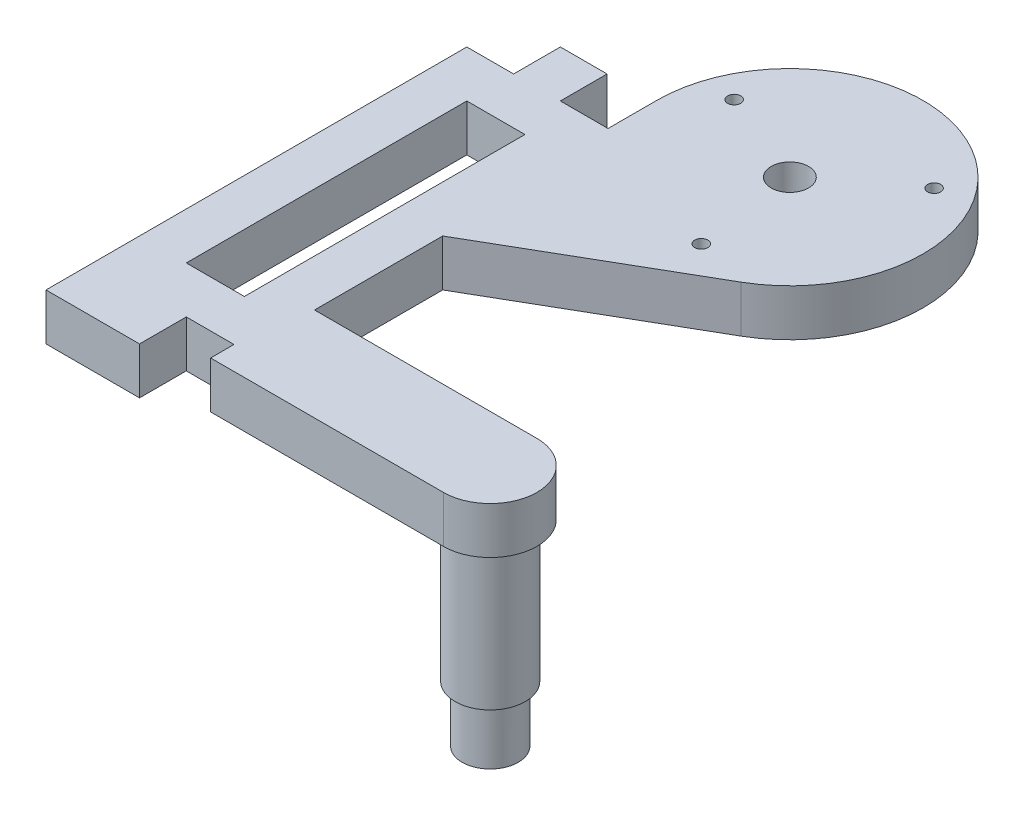
ISO-10303-21;
HEADER;
FILE_DESCRIPTION(('STEP AP214'),'2;1');
FILE_NAME('part.step','',(''),(''),'','','');
FILE_SCHEMA(('AUTOMOTIVE_DESIGN { 1 0 10303 214 1 1 1 1 }'));
ENDSEC;
DATA;
#1=APPLICATION_CONTEXT('core data for automotive mechanical design processes');
#2=APPLICATION_PROTOCOL_DEFINITION('international standard','automotive_design',2000,#1);
#3=PRODUCT_CONTEXT('',#1,'mechanical');
#4=PRODUCT('Part','Part','',(#3));
#5=PRODUCT_RELATED_PRODUCT_CATEGORY('part','',(#4));
#6=PRODUCT_DEFINITION_FORMATION('','',#4);
#7=PRODUCT_DEFINITION_CONTEXT('part definition',#1,'design');
#8=PRODUCT_DEFINITION('design','',#6,#7);
#9=PRODUCT_DEFINITION_SHAPE('','',#8);
#10=(LENGTH_UNIT() NAMED_UNIT(*) SI_UNIT(.MILLI.,.METRE.));
#11=(NAMED_UNIT(*) PLANE_ANGLE_UNIT() SI_UNIT($,.RADIAN.));
#12=(NAMED_UNIT(*) SI_UNIT($,.STERADIAN.) SOLID_ANGLE_UNIT());
#13=UNCERTAINTY_MEASURE_WITH_UNIT(LENGTH_MEASURE(1.E-05),#10,'distance_accuracy_value','');
#14=(GEOMETRIC_REPRESENTATION_CONTEXT(3) GLOBAL_UNCERTAINTY_ASSIGNED_CONTEXT((#13)) GLOBAL_UNIT_ASSIGNED_CONTEXT((#10,
#11,#12)) REPRESENTATION_CONTEXT('',''));
#15=CARTESIAN_POINT('',(0.,0.,0.));
#16=DIRECTION('',(0.,0.,1.));
#17=DIRECTION('',(1.,0.,0.));
#18=AXIS2_PLACEMENT_3D('',#15,#16,#17);
#19=CARTESIAN_POINT('',(0.,5.,-35.));
#20=DIRECTION('',(0.,0.,-1.));
#21=DIRECTION('',(-1.,0.,0.));
#22=AXIS2_PLACEMENT_3D('',#19,#20,#21);
#23=PLANE('',#22);
#24=DIRECTION('',(1.,0.,0.));
#25=VECTOR('',#24,1.);
#26=CARTESIAN_POINT('',(0.,0.,-35.));
#27=LINE('',#26,#25);
#28=CARTESIAN_POINT('',(5.,0.,-35.));
#29=VERTEX_POINT('',#28);
#30=CARTESIAN_POINT('',(11.2132580903823,0.,-35.));
#31=VERTEX_POINT('',#30);
#32=EDGE_CURVE('E297',#29,#31,#27,.T.);
#33=ORIENTED_EDGE('',*,*,#32,.T.);
#34=DIRECTION('',(0.,-1.,0.));
#35=VECTOR('',#34,1.);
#36=CARTESIAN_POINT('',(11.2132580903823,5.,-35.));
#37=LINE('',#36,#35);
#38=CARTESIAN_POINT('',(11.2132580903823,5.,-35.));
#39=VERTEX_POINT('',#38);
#40=EDGE_CURVE('E51',#39,#31,#37,.T.);
#41=ORIENTED_EDGE('',*,*,#40,.F.);
#42=DIRECTION('',(1.,0.,0.));
#43=VECTOR('',#42,1.);
#44=CARTESIAN_POINT('',(0.,5.,-35.));
#45=LINE('',#44,#43);
#46=CARTESIAN_POINT('',(5.,5.,-35.));
#47=VERTEX_POINT('',#46);
#48=EDGE_CURVE('E198',#47,#39,#45,.T.);
#49=ORIENTED_EDGE('',*,*,#48,.F.);
#50=DIRECTION('',(0.,-1.,0.));
#51=VECTOR('',#50,1.);
#52=CARTESIAN_POINT('',(5.,5.,-35.));
#53=LINE('',#52,#51);
#54=EDGE_CURVE('E59',#47,#29,#53,.T.);
#55=ORIENTED_EDGE('',*,*,#54,.T.);
#56=EDGE_LOOP('',(#33,#41,#49,#55));
#57=FACE_BOUND('',#56,.T.);
#58=ADVANCED_FACE('F41',(#57),#23,.F.);
#59=CARTESIAN_POINT('',(11.2132580903823,5.,0.));
#60=DIRECTION('',(1.,0.,0.));
#61=DIRECTION('',(0.,0.,-1.));
#62=AXIS2_PLACEMENT_3D('',#59,#60,#61);
#63=PLANE('',#62);
#64=DIRECTION('',(0.,0.,1.));
#65=VECTOR('',#64,1.);
#66=CARTESIAN_POINT('',(11.2132580903823,0.,0.));
#67=LINE('',#66,#65);
#68=CARTESIAN_POINT('',(11.2132580903823,0.,-5.));
#69=VERTEX_POINT('',#68);
#70=EDGE_CURVE('E207',#31,#69,#67,.T.);
#71=ORIENTED_EDGE('',*,*,#70,.T.);
#72=DIRECTION('',(0.,-1.,0.));
#73=VECTOR('',#72,1.);
#74=CARTESIAN_POINT('',(11.2132580903823,5.,-5.));
#75=LINE('',#74,#73);
#76=CARTESIAN_POINT('',(11.2132580903823,5.,-5.));
#77=VERTEX_POINT('',#76);
#78=EDGE_CURVE('E205',#77,#69,#75,.T.);
#79=ORIENTED_EDGE('',*,*,#78,.F.);
#80=DIRECTION('',(0.,0.,1.));
#81=VECTOR('',#80,1.);
#82=CARTESIAN_POINT('',(11.2132580903823,5.,0.));
#83=LINE('',#82,#81);
#84=EDGE_CURVE('E192',#39,#77,#83,.T.);
#85=ORIENTED_EDGE('',*,*,#84,.F.);
#86=ORIENTED_EDGE('',*,*,#40,.T.);
#87=EDGE_LOOP('',(#71,#79,#85,#86));
#88=FACE_BOUND('',#87,.T.);
#89=ADVANCED_FACE('F206',(#88),#63,.F.);
#90=CARTESIAN_POINT('',(0.,5.,-5.));
#91=DIRECTION('',(0.,0.,-1.));
#92=DIRECTION('',(-1.,0.,0.));
#93=AXIS2_PLACEMENT_3D('',#90,#91,#92);
#94=PLANE('',#93);
#95=DIRECTION('',(1.,0.,0.));
#96=VECTOR('',#95,1.);
#97=CARTESIAN_POINT('',(0.,0.,-5.));
#98=LINE('',#97,#96);
#99=CARTESIAN_POINT('',(5.,0.,-5.));
#100=VERTEX_POINT('',#99);
#101=EDGE_CURVE('E302',#100,#69,#98,.T.);
#102=ORIENTED_EDGE('',*,*,#101,.F.);
#103=DIRECTION('',(0.,-1.,0.));
#104=VECTOR('',#103,1.);
#105=CARTESIAN_POINT('',(5.,5.,-5.));
#106=LINE('',#105,#104);
#107=CARTESIAN_POINT('',(5.,5.,-5.));
#108=VERTEX_POINT('',#107);
#109=EDGE_CURVE('E124',#108,#100,#106,.T.);
#110=ORIENTED_EDGE('',*,*,#109,.F.);
#111=DIRECTION('',(1.,0.,0.));
#112=VECTOR('',#111,1.);
#113=CARTESIAN_POINT('',(0.,5.,-5.));
#114=LINE('',#113,#112);
#115=EDGE_CURVE('E197',#108,#77,#114,.T.);
#116=ORIENTED_EDGE('',*,*,#115,.T.);
#117=ORIENTED_EDGE('',*,*,#78,.T.);
#118=EDGE_LOOP('',(#102,#110,#116,#117));
#119=FACE_BOUND('',#118,.T.);
#120=ADVANCED_FACE('F212',(#119),#94,.T.);
#121=CARTESIAN_POINT('',(29.3300644655773,5.,-45.2120339474557));
#122=DIRECTION('',(0.,-1.,0.));
#123=DIRECTION('',(0.,0.,-1.));
#124=AXIS2_PLACEMENT_3D('',#121,#122,#123);
#125=CYLINDRICAL_SURFACE('',#124,14.2300644655773);
#126=CARTESIAN_POINT('',(29.3300644655773,0.,-45.2120339474557));
#127=DIRECTION('',(0.,1.,0.));
#128=DIRECTION('',(0.,0.,1.));
#129=AXIS2_PLACEMENT_3D('',#126,#127,#128);
#130=CIRCLE('',#129,14.2300644655773);
#131=CARTESIAN_POINT('',(36.4450966983659,0.,-32.8884366227755));
#132=VERTEX_POINT('',#131);
#133=CARTESIAN_POINT('',(15.1,0.,-45.2120339474557));
#134=VERTEX_POINT('',#133);
#135=EDGE_CURVE('E238',#132,#134,#130,.T.);
#136=ORIENTED_EDGE('',*,*,#135,.T.);
#137=DIRECTION('',(0.,-1.,0.));
#138=VECTOR('',#137,1.);
#139=CARTESIAN_POINT('',(15.1,5.,-45.2120339474557));
#140=LINE('',#139,#138);
#141=CARTESIAN_POINT('',(15.1,5.,-45.2120339474557));
#142=VERTEX_POINT('',#141);
#143=EDGE_CURVE('E312',#142,#134,#140,.T.);
#144=ORIENTED_EDGE('',*,*,#143,.F.);
#145=CARTESIAN_POINT('',(29.3300644655773,5.,-45.2120339474557));
#146=DIRECTION('',(0.,1.,0.));
#147=DIRECTION('',(0.,0.,1.));
#148=AXIS2_PLACEMENT_3D('',#145,#146,#147);
#149=CIRCLE('',#148,14.2300644655773);
#150=CARTESIAN_POINT('',(36.4450966983659,5.,-32.8884366227755));
#151=VERTEX_POINT('',#150);
#152=EDGE_CURVE('E403',#151,#142,#149,.T.);
#153=ORIENTED_EDGE('',*,*,#152,.F.);
#154=DIRECTION('',(0.,-1.,0.));
#155=VECTOR('',#154,1.);
#156=CARTESIAN_POINT('',(36.4450966983659,5.,-32.8884366227755));
#157=LINE('',#156,#155);
#158=EDGE_CURVE('E217',#151,#132,#157,.T.);
#159=ORIENTED_EDGE('',*,*,#158,.T.);
#160=EDGE_LOOP('',(#136,#144,#153,#159));
#161=FACE_BOUND('',#160,.T.);
#162=ADVANCED_FACE('F492',(#161),#125,.T.);
#163=CARTESIAN_POINT('',(15.1,5.,0.));
#164=DIRECTION('',(1.,0.,0.));
#165=DIRECTION('',(0.,0.,-1.));
#166=AXIS2_PLACEMENT_3D('',#163,#164,#165);
#167=PLANE('',#166);
#168=DIRECTION('',(0.,0.,1.));
#169=VECTOR('',#168,1.);
#170=CARTESIAN_POINT('',(15.1,0.,0.));
#171=LINE('',#170,#169);
#172=CARTESIAN_POINT('',(15.1,0.,-40.));
#173=VERTEX_POINT('',#172);
#174=EDGE_CURVE('E242',#134,#173,#171,.T.);
#175=ORIENTED_EDGE('',*,*,#174,.T.);
#176=DIRECTION('',(0.,-1.,0.));
#177=VECTOR('',#176,1.);
#178=CARTESIAN_POINT('',(15.1,5.,-40.));
#179=LINE('',#178,#177);
#180=CARTESIAN_POINT('',(15.1,5.,-40.));
#181=VERTEX_POINT('',#180);
#182=EDGE_CURVE('E367',#181,#173,#179,.T.);
#183=ORIENTED_EDGE('',*,*,#182,.F.);
#184=DIRECTION('',(0.,0.,1.));
#185=VECTOR('',#184,1.);
#186=CARTESIAN_POINT('',(15.1,5.,0.));
#187=LINE('',#186,#185);
#188=EDGE_CURVE('E137',#142,#181,#187,.T.);
#189=ORIENTED_EDGE('',*,*,#188,.F.);
#190=ORIENTED_EDGE('',*,*,#143,.T.);
#191=EDGE_LOOP('',(#175,#183,#189,#190));
#192=FACE_BOUND('',#191,.T.);
#193=ADVANCED_FACE('F487',(#192),#167,.F.);
#194=CARTESIAN_POINT('',(0.,5.,-40.));
#195=DIRECTION('',(0.,0.,-1.));
#196=DIRECTION('',(-1.,0.,0.));
#197=AXIS2_PLACEMENT_3D('',#194,#195,#196);
#198=PLANE('',#197);
#199=DIRECTION('',(1.,0.,0.));
#200=VECTOR('',#199,1.);
#201=CARTESIAN_POINT('',(0.,0.,-40.));
#202=LINE('',#201,#200);
#203=CARTESIAN_POINT('',(10.,0.,-40.));
#204=VERTEX_POINT('',#203);
#205=EDGE_CURVE('E246',#204,#173,#202,.T.);
#206=ORIENTED_EDGE('',*,*,#205,.F.);
#207=DIRECTION('',(0.,-1.,0.));
#208=VECTOR('',#207,1.);
#209=CARTESIAN_POINT('',(10.,5.,-40.));
#210=LINE('',#209,#208);
#211=CARTESIAN_POINT('',(10.,5.,-40.));
#212=VERTEX_POINT('',#211);
#213=EDGE_CURVE('E364',#212,#204,#210,.T.);
#214=ORIENTED_EDGE('',*,*,#213,.F.);
#215=DIRECTION('',(1.,0.,0.));
#216=VECTOR('',#215,1.);
#217=CARTESIAN_POINT('',(0.,5.,-40.));
#218=LINE('',#217,#216);
#219=EDGE_CURVE('E408',#212,#181,#218,.T.);
#220=ORIENTED_EDGE('',*,*,#219,.T.);
#221=ORIENTED_EDGE('',*,*,#182,.T.);
#222=EDGE_LOOP('',(#206,#214,#220,#221));
#223=FACE_BOUND('',#222,.T.);
#224=ADVANCED_FACE('F484',(#223),#198,.T.);
#225=CARTESIAN_POINT('',(10.,5.,0.));
#226=DIRECTION('',(-1.,0.,0.));
#227=DIRECTION('',(0.,0.,1.));
#228=AXIS2_PLACEMENT_3D('',#225,#226,#227);
#229=PLANE('',#228);
#230=DIRECTION('',(0.,0.,-1.));
#231=VECTOR('',#230,1.);
#232=CARTESIAN_POINT('',(10.,0.,0.));
#233=LINE('',#232,#231);
#234=CARTESIAN_POINT('',(10.,0.,-45.));
#235=VERTEX_POINT('',#234);
#236=EDGE_CURVE('E250',#204,#235,#233,.T.);
#237=ORIENTED_EDGE('',*,*,#236,.T.);
#238=DIRECTION('',(0.,-1.,0.));
#239=VECTOR('',#238,1.);
#240=CARTESIAN_POINT('',(10.,5.,-45.));
#241=LINE('',#240,#239);
#242=CARTESIAN_POINT('',(10.,5.,-45.));
#243=VERTEX_POINT('',#242);
#244=EDGE_CURVE('E360',#243,#235,#241,.T.);
#245=ORIENTED_EDGE('',*,*,#244,.F.);
#246=DIRECTION('',(0.,0.,-1.));
#247=VECTOR('',#246,1.);
#248=CARTESIAN_POINT('',(10.,5.,0.));
#249=LINE('',#248,#247);
#250=EDGE_CURVE('E412',#212,#243,#249,.T.);
#251=ORIENTED_EDGE('',*,*,#250,.F.);
#252=ORIENTED_EDGE('',*,*,#213,.T.);
#253=EDGE_LOOP('',(#237,#245,#251,#252));
#254=FACE_BOUND('',#253,.T.);
#255=ADVANCED_FACE('F538',(#254),#229,.F.);
#256=CARTESIAN_POINT('',(0.,5.,-45.));
#257=DIRECTION('',(0.,0.,1.));
#258=DIRECTION('',(1.,0.,0.));
#259=AXIS2_PLACEMENT_3D('',#256,#257,#258);
#260=PLANE('',#259);
#261=DIRECTION('',(-1.,0.,0.));
#262=VECTOR('',#261,1.);
#263=CARTESIAN_POINT('',(0.,0.,-45.));
#264=LINE('',#263,#262);
#265=CARTESIAN_POINT('',(5.,0.,-45.));
#266=VERTEX_POINT('',#265);
#267=EDGE_CURVE('E254',#235,#266,#264,.T.);
#268=ORIENTED_EDGE('',*,*,#267,.T.);
#269=DIRECTION('',(0.,-1.,0.));
#270=VECTOR('',#269,1.);
#271=CARTESIAN_POINT('',(5.,5.,-45.));
#272=LINE('',#271,#270);
#273=CARTESIAN_POINT('',(5.,5.,-45.));
#274=VERTEX_POINT('',#273);
#275=EDGE_CURVE('E357',#274,#266,#272,.T.);
#276=ORIENTED_EDGE('',*,*,#275,.F.);
#277=DIRECTION('',(-1.,0.,0.));
#278=VECTOR('',#277,1.);
#279=CARTESIAN_POINT('',(0.,5.,-45.));
#280=LINE('',#279,#278);
#281=EDGE_CURVE('E416',#243,#274,#280,.T.);
#282=ORIENTED_EDGE('',*,*,#281,.F.);
#283=ORIENTED_EDGE('',*,*,#244,.T.);
#284=EDGE_LOOP('',(#268,#276,#282,#283));
#285=FACE_BOUND('',#284,.T.);
#286=ADVANCED_FACE('F478',(#285),#260,.F.);
#287=CARTESIAN_POINT('',(5.,5.,0.));
#288=DIRECTION('',(-1.,0.,0.));
#289=DIRECTION('',(0.,0.,1.));
#290=AXIS2_PLACEMENT_3D('',#287,#288,#289);
#291=PLANE('',#290);
#292=DIRECTION('',(0.,0.,-1.));
#293=VECTOR('',#292,1.);
#294=CARTESIAN_POINT('',(5.,0.,0.));
#295=LINE('',#294,#293);
#296=CARTESIAN_POINT('',(5.,0.,-40.));
#297=VERTEX_POINT('',#296);
#298=EDGE_CURVE('E258',#297,#266,#295,.T.);
#299=ORIENTED_EDGE('',*,*,#298,.F.);
#300=DIRECTION('',(0.,-1.,0.));
#301=VECTOR('',#300,1.);
#302=CARTESIAN_POINT('',(5.,5.,-40.));
#303=LINE('',#302,#301);
#304=CARTESIAN_POINT('',(5.,5.,-40.));
#305=VERTEX_POINT('',#304);
#306=EDGE_CURVE('E354',#305,#297,#303,.T.);
#307=ORIENTED_EDGE('',*,*,#306,.F.);
#308=DIRECTION('',(0.,0.,-1.));
#309=VECTOR('',#308,1.);
#310=CARTESIAN_POINT('',(5.,5.,0.));
#311=LINE('',#310,#309);
#312=EDGE_CURVE('E419',#305,#274,#311,.T.);
#313=ORIENTED_EDGE('',*,*,#312,.T.);
#314=ORIENTED_EDGE('',*,*,#275,.T.);
#315=EDGE_LOOP('',(#299,#307,#313,#314));
#316=FACE_BOUND('',#315,.T.);
#317=ADVANCED_FACE('F474',(#316),#291,.T.);
#318=CARTESIAN_POINT('',(0.,0.,-40.));
#319=VERTEX_POINT('',#318);
#320=EDGE_CURVE('E251',#319,#297,#202,.T.);
#321=ORIENTED_EDGE('',*,*,#320,.F.);
#322=DIRECTION('',(0.,-1.,0.));
#323=VECTOR('',#322,1.);
#324=CARTESIAN_POINT('',(0.,5.,-40.));
#325=LINE('',#324,#323);
#326=CARTESIAN_POINT('',(0.,5.,-40.));
#327=VERTEX_POINT('',#326);
#328=EDGE_CURVE('E351',#327,#319,#325,.T.);
#329=ORIENTED_EDGE('',*,*,#328,.F.);
#330=EDGE_CURVE('E413',#327,#305,#218,.T.);
#331=ORIENTED_EDGE('',*,*,#330,.T.);
#332=ORIENTED_EDGE('',*,*,#306,.T.);
#333=EDGE_LOOP('',(#321,#329,#331,#332));
#334=FACE_BOUND('',#333,.T.);
#335=ADVANCED_FACE('F470',(#334),#198,.T.);
#336=CARTESIAN_POINT('',(0.,5.,0.));
#337=DIRECTION('',(-1.,0.,0.));
#338=DIRECTION('',(0.,0.,1.));
#339=AXIS2_PLACEMENT_3D('',#336,#337,#338);
#340=PLANE('',#339);
#341=DIRECTION('',(0.,0.,-1.));
#342=VECTOR('',#341,1.);
#343=CARTESIAN_POINT('',(0.,0.,0.));
#344=LINE('',#343,#342);
#345=CARTESIAN_POINT('',(0.,0.,5.));
#346=VERTEX_POINT('',#345);
#347=EDGE_CURVE('E262',#346,#319,#344,.T.);
#348=ORIENTED_EDGE('',*,*,#347,.F.);
#349=DIRECTION('',(0.,-1.,0.));
#350=VECTOR('',#349,1.);
#351=CARTESIAN_POINT('',(0.,5.,5.));
#352=LINE('',#351,#350);
#353=CARTESIAN_POINT('',(0.,5.,5.));
#354=VERTEX_POINT('',#353);
#355=EDGE_CURVE('E348',#354,#346,#352,.T.);
#356=ORIENTED_EDGE('',*,*,#355,.F.);
#357=DIRECTION('',(0.,0.,-1.));
#358=VECTOR('',#357,1.);
#359=CARTESIAN_POINT('',(0.,5.,0.));
#360=LINE('',#359,#358);
#361=EDGE_CURVE('E423',#354,#327,#360,.T.);
#362=ORIENTED_EDGE('',*,*,#361,.T.);
#363=ORIENTED_EDGE('',*,*,#328,.T.);
#364=EDGE_LOOP('',(#348,#356,#362,#363));
#365=FACE_BOUND('',#364,.T.);
#366=ADVANCED_FACE('F535',(#365),#340,.T.);
#367=CARTESIAN_POINT('',(0.,5.,5.));
#368=DIRECTION('',(0.,0.,-1.));
#369=DIRECTION('',(-1.,0.,0.));
#370=AXIS2_PLACEMENT_3D('',#367,#368,#369);
#371=PLANE('',#370);
#372=DIRECTION('',(1.,0.,0.));
#373=VECTOR('',#372,1.);
#374=CARTESIAN_POINT('',(0.,0.,5.));
#375=LINE('',#374,#373);
#376=CARTESIAN_POINT('',(10.,0.,5.));
#377=VERTEX_POINT('',#376);
#378=EDGE_CURVE('E266',#346,#377,#375,.T.);
#379=ORIENTED_EDGE('',*,*,#378,.T.);
#380=DIRECTION('',(0.,-1.,0.));
#381=VECTOR('',#380,1.);
#382=CARTESIAN_POINT('',(10.,5.,5.));
#383=LINE('',#382,#381);
#384=CARTESIAN_POINT('',(10.,5.,5.));
#385=VERTEX_POINT('',#384);
#386=EDGE_CURVE('E345',#385,#377,#383,.T.);
#387=ORIENTED_EDGE('',*,*,#386,.F.);
#388=DIRECTION('',(1.,0.,0.));
#389=VECTOR('',#388,1.);
#390=CARTESIAN_POINT('',(0.,5.,5.));
#391=LINE('',#390,#389);
#392=EDGE_CURVE('E427',#354,#385,#391,.T.);
#393=ORIENTED_EDGE('',*,*,#392,.F.);
#394=ORIENTED_EDGE('',*,*,#355,.T.);
#395=EDGE_LOOP('',(#379,#387,#393,#394));
#396=FACE_BOUND('',#395,.T.);
#397=ADVANCED_FACE('F533',(#396),#371,.F.);
#398=CARTESIAN_POINT('',(10.,5.,0.));
#399=DIRECTION('',(1.,0.,0.));
#400=DIRECTION('',(0.,0.,-1.));
#401=AXIS2_PLACEMENT_3D('',#398,#399,#400);
#402=PLANE('',#401);
#403=DIRECTION('',(0.,0.,1.));
#404=VECTOR('',#403,1.);
#405=CARTESIAN_POINT('',(10.,0.,0.));
#406=LINE('',#405,#404);
#407=CARTESIAN_POINT('',(10.,0.,0.));
#408=VERTEX_POINT('',#407);
#409=EDGE_CURVE('E270',#408,#377,#406,.T.);
#410=ORIENTED_EDGE('',*,*,#409,.F.);
#411=DIRECTION('',(0.,-1.,0.));
#412=VECTOR('',#411,1.);
#413=CARTESIAN_POINT('',(10.,5.,0.));
#414=LINE('',#413,#412);
#415=CARTESIAN_POINT('',(10.,5.,0.));
#416=VERTEX_POINT('',#415);
#417=EDGE_CURVE('E342',#416,#408,#414,.T.);
#418=ORIENTED_EDGE('',*,*,#417,.F.);
#419=DIRECTION('',(0.,0.,1.));
#420=VECTOR('',#419,1.);
#421=CARTESIAN_POINT('',(10.,5.,0.));
#422=LINE('',#421,#420);
#423=EDGE_CURVE('E430',#416,#385,#422,.T.);
#424=ORIENTED_EDGE('',*,*,#423,.T.);
#425=ORIENTED_EDGE('',*,*,#386,.T.);
#426=EDGE_LOOP('',(#410,#418,#424,#425));
#427=FACE_BOUND('',#426,.T.);
#428=ADVANCED_FACE('F529',(#427),#402,.T.);
#429=CARTESIAN_POINT('',(0.,5.,0.));
#430=DIRECTION('',(0.,0.,-1.));
#431=DIRECTION('',(-1.,0.,0.));
#432=AXIS2_PLACEMENT_3D('',#429,#430,#431);
#433=PLANE('',#432);
#434=DIRECTION('',(1.,0.,0.));
#435=VECTOR('',#434,1.);
#436=CARTESIAN_POINT('',(0.,0.,0.));
#437=LINE('',#436,#435);
#438=CARTESIAN_POINT('',(15.1,0.,0.));
#439=VERTEX_POINT('',#438);
#440=EDGE_CURVE('E274',#408,#439,#437,.T.);
#441=ORIENTED_EDGE('',*,*,#440,.T.);
#442=DIRECTION('',(0.,-1.,0.));
#443=VECTOR('',#442,1.);
#444=CARTESIAN_POINT('',(15.1,5.,0.));
#445=LINE('',#444,#443);
#446=CARTESIAN_POINT('',(15.1,5.,0.));
#447=VERTEX_POINT('',#446);
#448=EDGE_CURVE('E338',#447,#439,#445,.T.);
#449=ORIENTED_EDGE('',*,*,#448,.F.);
#450=DIRECTION('',(1.,0.,0.));
#451=VECTOR('',#450,1.);
#452=CARTESIAN_POINT('',(0.,5.,0.));
#453=LINE('',#452,#451);
#454=EDGE_CURVE('E434',#416,#447,#453,.T.);
#455=ORIENTED_EDGE('',*,*,#454,.F.);
#456=ORIENTED_EDGE('',*,*,#417,.T.);
#457=EDGE_LOOP('',(#441,#449,#455,#456));
#458=FACE_BOUND('',#457,.T.);
#459=ADVANCED_FACE('F525',(#458),#433,.F.);
#460=CARTESIAN_POINT('',(15.1,5.,0.));
#461=DIRECTION('',(1.,0.,0.));
#462=DIRECTION('',(0.,0.,-1.));
#463=AXIS2_PLACEMENT_3D('',#460,#461,#462);
#464=PLANE('',#463);
#465=DIRECTION('',(0.,0.,1.));
#466=VECTOR('',#465,1.);
#467=CARTESIAN_POINT('',(15.1,0.,0.));
#468=LINE('',#467,#466);
#469=CARTESIAN_POINT('',(15.1,0.,2.5));
#470=VERTEX_POINT('',#469);
#471=EDGE_CURVE('E277',#439,#470,#468,.T.);
#472=ORIENTED_EDGE('',*,*,#471,.T.);
#473=DIRECTION('',(0.,-1.,0.));
#474=VECTOR('',#473,1.);
#475=CARTESIAN_POINT('',(15.1,5.,2.5));
#476=LINE('',#475,#474);
#477=CARTESIAN_POINT('',(15.1,5.,2.5));
#478=VERTEX_POINT('',#477);
#479=EDGE_CURVE('E334',#478,#470,#476,.T.);
#480=ORIENTED_EDGE('',*,*,#479,.F.);
#481=DIRECTION('',(0.,0.,1.));
#482=VECTOR('',#481,1.);
#483=CARTESIAN_POINT('',(15.1,5.,0.));
#484=LINE('',#483,#482);
#485=EDGE_CURVE('E437',#447,#478,#484,.T.);
#486=ORIENTED_EDGE('',*,*,#485,.F.);
#487=ORIENTED_EDGE('',*,*,#448,.T.);
#488=EDGE_LOOP('',(#472,#480,#486,#487));
#489=FACE_BOUND('',#488,.T.);
#490=ADVANCED_FACE('F521',(#489),#464,.F.);
#491=CARTESIAN_POINT('',(0.,5.,2.5));
#492=DIRECTION('',(0.,0.,-1.));
#493=DIRECTION('',(-1.,0.,0.));
#494=AXIS2_PLACEMENT_3D('',#491,#492,#493);
#495=PLANE('',#494);
#496=DIRECTION('',(1.,0.,0.));
#497=VECTOR('',#496,1.);
#498=CARTESIAN_POINT('',(0.,0.,2.5));
#499=LINE('',#498,#497);
#500=CARTESIAN_POINT('',(40.,0.,2.5));
#501=VERTEX_POINT('',#500);
#502=EDGE_CURVE('E280',#470,#501,#499,.T.);
#503=ORIENTED_EDGE('',*,*,#502,.T.);
#504=DIRECTION('',(0.,-1.,0.));
#505=VECTOR('',#504,1.);
#506=CARTESIAN_POINT('',(40.,5.,2.5));
#507=LINE('',#506,#505);
#508=CARTESIAN_POINT('',(40.,5.,2.5));
#509=VERTEX_POINT('',#508);
#510=EDGE_CURVE('E330',#509,#501,#507,.T.);
#511=ORIENTED_EDGE('',*,*,#510,.F.);
#512=DIRECTION('',(1.,0.,0.));
#513=VECTOR('',#512,1.);
#514=CARTESIAN_POINT('',(0.,5.,2.5));
#515=LINE('',#514,#513);
#516=EDGE_CURVE('E440',#478,#509,#515,.T.);
#517=ORIENTED_EDGE('',*,*,#516,.F.);
#518=ORIENTED_EDGE('',*,*,#479,.T.);
#519=EDGE_LOOP('',(#503,#511,#517,#518));
#520=FACE_BOUND('',#519,.T.);
#521=ADVANCED_FACE('F516',(#520),#495,.F.);
#522=CARTESIAN_POINT('',(40.,5.,-2.5));
#523=DIRECTION('',(0.,-1.,0.));
#524=DIRECTION('',(0.,0.,-1.));
#525=AXIS2_PLACEMENT_3D('',#522,#523,#524);
#526=CYLINDRICAL_SURFACE('',#525,5.);
#527=CARTESIAN_POINT('',(40.,0.,-2.5));
#528=DIRECTION('',(0.,1.,0.));
#529=DIRECTION('',(0.,0.,1.));
#530=AXIS2_PLACEMENT_3D('',#527,#528,#529);
#531=CIRCLE('',#530,5.);
#532=CARTESIAN_POINT('',(40.,0.,-7.5));
#533=VERTEX_POINT('',#532);
#534=EDGE_CURVE('E283',#501,#533,#531,.T.);
#535=ORIENTED_EDGE('',*,*,#534,.T.);
#536=DIRECTION('',(0.,-1.,0.));
#537=VECTOR('',#536,1.);
#538=CARTESIAN_POINT('',(40.,5.,-7.5));
#539=LINE('',#538,#537);
#540=CARTESIAN_POINT('',(40.,5.,-7.5));
#541=VERTEX_POINT('',#540);
#542=EDGE_CURVE('E327',#541,#533,#539,.T.);
#543=ORIENTED_EDGE('',*,*,#542,.F.);
#544=CARTESIAN_POINT('',(40.,5.,-2.5));
#545=DIRECTION('',(0.,1.,0.));
#546=DIRECTION('',(0.,0.,1.));
#547=AXIS2_PLACEMENT_3D('',#544,#545,#546);
#548=CIRCLE('',#547,5.);
#549=EDGE_CURVE('E443',#509,#541,#548,.T.);
#550=ORIENTED_EDGE('',*,*,#549,.F.);
#551=ORIENTED_EDGE('',*,*,#510,.T.);
#552=EDGE_LOOP('',(#535,#543,#550,#551));
#553=FACE_BOUND('',#552,.T.);
#554=ADVANCED_FACE('F510',(#553),#526,.T.);
#555=CARTESIAN_POINT('',(0.,5.,-7.5));
#556=DIRECTION('',(0.,0.,-1.));
#557=DIRECTION('',(-1.,0.,0.));
#558=AXIS2_PLACEMENT_3D('',#555,#556,#557);
#559=PLANE('',#558);
#560=DIRECTION('',(1.,0.,0.));
#561=VECTOR('',#560,1.);
#562=CARTESIAN_POINT('',(0.,0.,-7.5));
#563=LINE('',#562,#561);
#564=CARTESIAN_POINT('',(16.2132580903823,0.,-7.5));
#565=VERTEX_POINT('',#564);
#566=EDGE_CURVE('E287',#565,#533,#563,.T.);
#567=ORIENTED_EDGE('',*,*,#566,.F.);
#568=DIRECTION('',(0.,-1.,0.));
#569=VECTOR('',#568,1.);
#570=CARTESIAN_POINT('',(16.2132580903823,5.,-7.5));
#571=LINE('',#570,#569);
#572=CARTESIAN_POINT('',(16.2132580903823,5.,-7.5));
#573=VERTEX_POINT('',#572);
#574=EDGE_CURVE('E324',#573,#565,#571,.T.);
#575=ORIENTED_EDGE('',*,*,#574,.F.);
#576=DIRECTION('',(1.,0.,0.));
#577=VECTOR('',#576,1.);
#578=CARTESIAN_POINT('',(0.,5.,-7.5));
#579=LINE('',#578,#577);
#580=EDGE_CURVE('E446',#573,#541,#579,.T.);
#581=ORIENTED_EDGE('',*,*,#580,.T.);
#582=ORIENTED_EDGE('',*,*,#542,.T.);
#583=EDGE_LOOP('',(#567,#575,#581,#582));
#584=FACE_BOUND('',#583,.T.);
#585=ADVANCED_FACE('F506',(#584),#559,.T.);
#586=CARTESIAN_POINT('',(16.2132580903823,5.,0.));
#587=DIRECTION('',(-1.,0.,0.));
#588=DIRECTION('',(0.,0.,1.));
#589=AXIS2_PLACEMENT_3D('',#586,#587,#588);
#590=PLANE('',#589);
#591=DIRECTION('',(0.,0.,-1.));
#592=VECTOR('',#591,1.);
#593=CARTESIAN_POINT('',(16.2132580903823,0.,0.));
#594=LINE('',#593,#592);
#595=CARTESIAN_POINT('',(16.2132580903823,0.,-21.2075791562551));
#596=VERTEX_POINT('',#595);
#597=EDGE_CURVE('E291',#565,#596,#594,.T.);
#598=ORIENTED_EDGE('',*,*,#597,.T.);
#599=DIRECTION('',(0.,-1.,0.));
#600=VECTOR('',#599,1.);
#601=CARTESIAN_POINT('',(16.2132580903823,5.,-21.2075791562551));
#602=LINE('',#601,#600);
#603=CARTESIAN_POINT('',(16.2132580903823,5.,-21.2075791562551));
#604=VERTEX_POINT('',#603);
#605=EDGE_CURVE('E320',#604,#596,#602,.T.);
#606=ORIENTED_EDGE('',*,*,#605,.F.);
#607=DIRECTION('',(0.,0.,-1.));
#608=VECTOR('',#607,1.);
#609=CARTESIAN_POINT('',(16.2132580903823,5.,0.));
#610=LINE('',#609,#608);
#611=EDGE_CURVE('E450',#573,#604,#610,.T.);
#612=ORIENTED_EDGE('',*,*,#611,.F.);
#613=ORIENTED_EDGE('',*,*,#574,.T.);
#614=EDGE_LOOP('',(#598,#606,#612,#613));
#615=FACE_BOUND('',#614,.T.);
#616=ADVANCED_FACE('F501',(#615),#590,.F.);
#617=CARTESIAN_POINT('',(-5.1298366284476,5.,-8.8851376749991));
#618=DIRECTION('',(-0.499999999999998,0.,-0.86602540378444));
#619=DIRECTION('',(-0.86602540378444,0.,0.499999999999998));
#620=AXIS2_PLACEMENT_3D('',#617,#618,#619);
#621=PLANE('',#620);
#622=DIRECTION('',(0.86602540378444,0.,-0.499999999999998));
#623=VECTOR('',#622,1.);
#624=CARTESIAN_POINT('',(-5.1298366284476,0.,-8.8851376749991));
#625=LINE('',#624,#623);
#626=EDGE_CURVE('E294',#596,#132,#625,.T.);
#627=ORIENTED_EDGE('',*,*,#626,.T.);
#628=ORIENTED_EDGE('',*,*,#158,.F.);
#629=DIRECTION('',(0.86602540378444,0.,-0.499999999999998));
#630=VECTOR('',#629,1.);
#631=CARTESIAN_POINT('',(-5.1298366284476,5.,-8.8851376749991));
#632=LINE('',#631,#630);
#633=EDGE_CURVE('E453',#604,#151,#632,.T.);
#634=ORIENTED_EDGE('',*,*,#633,.F.);
#635=ORIENTED_EDGE('',*,*,#605,.T.);
#636=EDGE_LOOP('',(#627,#628,#634,#635));
#637=FACE_BOUND('',#636,.T.);
#638=ADVANCED_FACE('F497',(#637),#621,.F.);
#639=CARTESIAN_POINT('',(29.3300644655773,5.,-45.2120339474557));
#640=DIRECTION('',(0.,-1.,0.));
#641=DIRECTION('',(0.,0.,-1.));
#642=AXIS2_PLACEMENT_3D('',#639,#640,#641);
#643=CYLINDRICAL_SURFACE('',#642,2.00000000000001);
#644=CARTESIAN_POINT('',(29.3300644655773,5.,-45.2120339474557));
#645=DIRECTION('',(0.,1.,0.));
#646=DIRECTION('',(0.,0.,1.));
#647=AXIS2_PLACEMENT_3D('',#644,#645,#646);
#648=CIRCLE('',#647,2.00000000000001);
#649=CARTESIAN_POINT('',(29.3300644655773,5.,-43.2120339474557));
#650=VERTEX_POINT('',#649);
#651=EDGE_CURVE('E399',#650,#650,#648,.T.);
#652=ORIENTED_EDGE('',*,*,#651,.T.);
#653=EDGE_LOOP('',(#652));
#654=FACE_BOUND('',#653,.T.);
#655=CARTESIAN_POINT('',(29.3300644655773,0.,-45.2120339474557));
#656=DIRECTION('',(0.,1.,0.));
#657=DIRECTION('',(0.,0.,1.));
#658=AXIS2_PLACEMENT_3D('',#655,#656,#657);
#659=CIRCLE('',#658,2.00000000000001);
#660=CARTESIAN_POINT('',(29.3300644655773,0.,-43.2120339474557));
#661=VERTEX_POINT('',#660);
#662=EDGE_CURVE('E234',#661,#661,#659,.T.);
#663=ORIENTED_EDGE('',*,*,#662,.F.);
#664=EDGE_LOOP('',(#663));
#665=FACE_BOUND('',#664,.T.);
#666=ADVANCED_FACE('F558',(#654,#665),#643,.F.);
#667=CARTESIAN_POINT('',(38.0569512087808,5.,-51.9084096665516));
#668=DIRECTION('',(0.,-1.,0.));
#669=DIRECTION('',(0.,0.,-1.));
#670=AXIS2_PLACEMENT_3D('',#667,#668,#669);
#671=CYLINDRICAL_SURFACE('',#670,0.700000000000008);
#672=CARTESIAN_POINT('',(38.0569512087808,5.,-51.9084096665516));
#673=DIRECTION('',(0.,1.,0.));
#674=DIRECTION('',(0.,0.,1.));
#675=AXIS2_PLACEMENT_3D('',#672,#673,#674);
#676=CIRCLE('',#675,0.700000000000008);
#677=CARTESIAN_POINT('',(38.0569512087808,5.,-51.2084096665516));
#678=VERTEX_POINT('',#677);
#679=EDGE_CURVE('E395',#678,#678,#676,.T.);
#680=ORIENTED_EDGE('',*,*,#679,.T.);
#681=EDGE_LOOP('',(#680));
#682=FACE_BOUND('',#681,.T.);
#683=CARTESIAN_POINT('',(38.0569512087808,0.,-51.9084096665516));
#684=DIRECTION('',(0.,1.,0.));
#685=DIRECTION('',(0.,0.,1.));
#686=AXIS2_PLACEMENT_3D('',#683,#684,#685);
#687=CIRCLE('',#686,0.700000000000008);
#688=CARTESIAN_POINT('',(38.0569512087808,0.,-51.2084096665516));
#689=VERTEX_POINT('',#688);
#690=EDGE_CURVE('E230',#689,#689,#687,.T.);
#691=ORIENTED_EDGE('',*,*,#690,.F.);
#692=EDGE_LOOP('',(#691));
#693=FACE_BOUND('',#692,.T.);
#694=ADVANCED_FACE('F633',(#682,#693),#671,.F.);
#695=CARTESIAN_POINT('',(30.7658525799984,5.,-34.3061404723436));
#696=DIRECTION('',(0.,-1.,0.));
#697=DIRECTION('',(0.,0.,-1.));
#698=AXIS2_PLACEMENT_3D('',#695,#696,#697);
#699=CYLINDRICAL_SURFACE('',#698,0.700000000000018);
#700=CARTESIAN_POINT('',(30.7658525799984,5.,-34.3061404723436));
#701=DIRECTION('',(0.,1.,0.));
#702=DIRECTION('',(0.,0.,1.));
#703=AXIS2_PLACEMENT_3D('',#700,#701,#702);
#704=CIRCLE('',#703,0.700000000000018);
#705=CARTESIAN_POINT('',(30.7658525799984,5.,-33.6061404723436));
#706=VERTEX_POINT('',#705);
#707=EDGE_CURVE('E391',#706,#706,#704,.T.);
#708=ORIENTED_EDGE('',*,*,#707,.T.);
#709=EDGE_LOOP('',(#708));
#710=FACE_BOUND('',#709,.T.);
#711=CARTESIAN_POINT('',(30.7658525799984,0.,-34.3061404723436));
#712=DIRECTION('',(0.,1.,0.));
#713=DIRECTION('',(0.,0.,1.));
#714=AXIS2_PLACEMENT_3D('',#711,#712,#713);
#715=CIRCLE('',#714,0.700000000000018);
#716=CARTESIAN_POINT('',(30.7658525799984,0.,-33.6061404723436));
#717=VERTEX_POINT('',#716);
#718=EDGE_CURVE('E225',#717,#717,#715,.T.);
#719=ORIENTED_EDGE('',*,*,#718,.F.);
#720=EDGE_LOOP('',(#719));
#721=FACE_BOUND('',#720,.T.);
#722=ADVANCED_FACE('F641',(#710,#721),#699,.F.);
#723=CARTESIAN_POINT('',(19.1673896079532,5.,-49.4215517034712));
#724=DIRECTION('',(0.,-1.,0.));
#725=DIRECTION('',(0.,0.,-1.));
#726=AXIS2_PLACEMENT_3D('',#723,#724,#725);
#727=CYLINDRICAL_SURFACE('',#726,0.700000000000001);
#728=CARTESIAN_POINT('',(19.1673896079532,5.,-49.4215517034712));
#729=DIRECTION('',(0.,1.,0.));
#730=DIRECTION('',(0.,0.,1.));
#731=AXIS2_PLACEMENT_3D('',#728,#729,#730);
#732=CIRCLE('',#731,0.700000000000001);
#733=CARTESIAN_POINT('',(19.1673896079532,5.,-48.7215517034712));
#734=VERTEX_POINT('',#733);
#735=EDGE_CURVE('E309',#734,#734,#732,.T.);
#736=ORIENTED_EDGE('',*,*,#735,.T.);
#737=EDGE_LOOP('',(#736));
#738=FACE_BOUND('',#737,.T.);
#739=CARTESIAN_POINT('',(19.1673896079532,0.,-49.4215517034712));
#740=DIRECTION('',(0.,1.,0.));
#741=DIRECTION('',(0.,0.,1.));
#742=AXIS2_PLACEMENT_3D('',#739,#740,#741);
#743=CIRCLE('',#742,0.700000000000001);
#744=CARTESIAN_POINT('',(19.1673896079532,0.,-48.7215517034712));
#745=VERTEX_POINT('',#744);
#746=EDGE_CURVE('E221',#745,#745,#743,.T.);
#747=ORIENTED_EDGE('',*,*,#746,.F.);
#748=EDGE_LOOP('',(#747));
#749=FACE_BOUND('',#748,.T.);
#750=ADVANCED_FACE('F43',(#738,#749),#727,.F.);
#751=CARTESIAN_POINT('',(5.,5.,0.));
#752=DIRECTION('',(1.,0.,0.));
#753=DIRECTION('',(0.,0.,-1.));
#754=AXIS2_PLACEMENT_3D('',#751,#752,#753);
#755=PLANE('',#754);
#756=DIRECTION('',(0.,0.,1.));
#757=VECTOR('',#756,1.);
#758=CARTESIAN_POINT('',(5.,0.,0.));
#759=LINE('',#758,#757);
#760=EDGE_CURVE('E305',#29,#100,#759,.T.);
#761=ORIENTED_EDGE('',*,*,#760,.F.);
#762=ORIENTED_EDGE('',*,*,#54,.F.);
#763=DIRECTION('',(0.,0.,1.));
#764=VECTOR('',#763,1.);
#765=CARTESIAN_POINT('',(5.,5.,0.));
#766=LINE('',#765,#764);
#767=EDGE_CURVE('E214',#47,#108,#766,.T.);
#768=ORIENTED_EDGE('',*,*,#767,.T.);
#769=ORIENTED_EDGE('',*,*,#109,.T.);
#770=EDGE_LOOP('',(#761,#762,#768,#769));
#771=FACE_BOUND('',#770,.T.);
#772=ADVANCED_FACE('F655',(#771),#755,.T.);
#773=CARTESIAN_POINT('',(0.,5.,0.));
#774=DIRECTION('',(0.,1.,0.));
#775=DIRECTION('',(0.,0.,1.));
#776=AXIS2_PLACEMENT_3D('',#773,#774,#775);
#777=PLANE('',#776);
#778=ORIENTED_EDGE('',*,*,#735,.F.);
#779=EDGE_LOOP('',(#778));
#780=FACE_BOUND('',#779,.T.);
#781=ORIENTED_EDGE('',*,*,#707,.F.);
#782=EDGE_LOOP('',(#781));
#783=FACE_BOUND('',#782,.T.);
#784=ORIENTED_EDGE('',*,*,#679,.F.);
#785=EDGE_LOOP('',(#784));
#786=FACE_BOUND('',#785,.T.);
#787=ORIENTED_EDGE('',*,*,#651,.F.);
#788=EDGE_LOOP('',(#787));
#789=FACE_BOUND('',#788,.T.);
#790=ORIENTED_EDGE('',*,*,#152,.T.);
#791=ORIENTED_EDGE('',*,*,#188,.T.);
#792=ORIENTED_EDGE('',*,*,#219,.F.);
#793=ORIENTED_EDGE('',*,*,#250,.T.);
#794=ORIENTED_EDGE('',*,*,#281,.T.);
#795=ORIENTED_EDGE('',*,*,#312,.F.);
#796=ORIENTED_EDGE('',*,*,#330,.F.);
#797=ORIENTED_EDGE('',*,*,#361,.F.);
#798=ORIENTED_EDGE('',*,*,#392,.T.);
#799=ORIENTED_EDGE('',*,*,#423,.F.);
#800=ORIENTED_EDGE('',*,*,#454,.T.);
#801=ORIENTED_EDGE('',*,*,#485,.T.);
#802=ORIENTED_EDGE('',*,*,#516,.T.);
#803=ORIENTED_EDGE('',*,*,#549,.T.);
#804=ORIENTED_EDGE('',*,*,#580,.F.);
#805=ORIENTED_EDGE('',*,*,#611,.T.);
#806=ORIENTED_EDGE('',*,*,#633,.T.);
#807=EDGE_LOOP('',(#790,#791,#792,#793,#794,#795,#796,#797,#798,#799,#800,#801,#802,#803,#804,
#805,#806));
#808=FACE_BOUND('',#807,.T.);
#809=ORIENTED_EDGE('',*,*,#48,.T.);
#810=ORIENTED_EDGE('',*,*,#84,.T.);
#811=ORIENTED_EDGE('',*,*,#115,.F.);
#812=ORIENTED_EDGE('',*,*,#767,.F.);
#813=EDGE_LOOP('',(#809,#810,#811,#812));
#814=FACE_BOUND('',#813,.T.);
#815=ADVANCED_FACE('F194',(#780,#783,#786,#789,#808,#814),#777,.T.);
#816=CARTESIAN_POINT('',(0.,0.,0.));
#817=DIRECTION('',(0.,1.,0.));
#818=DIRECTION('',(0.,0.,1.));
#819=AXIS2_PLACEMENT_3D('',#816,#817,#818);
#820=PLANE('',#819);
#821=CARTESIAN_POINT('',(40.,0.,-2.5));
#822=DIRECTION('',(0.,1.,0.));
#823=DIRECTION('',(0.,0.,1.));
#824=AXIS2_PLACEMENT_3D('',#821,#822,#823);
#825=CIRCLE('',#824,3.75);
#826=CARTESIAN_POINT('',(40.,0.,1.25));
#827=VERTEX_POINT('',#826);
#828=EDGE_CURVE('E226',#827,#827,#825,.T.);
#829=ORIENTED_EDGE('',*,*,#828,.T.);
#830=EDGE_LOOP('',(#829));
#831=FACE_BOUND('',#830,.T.);
#832=ORIENTED_EDGE('',*,*,#746,.T.);
#833=EDGE_LOOP('',(#832));
#834=FACE_BOUND('',#833,.T.);
#835=ORIENTED_EDGE('',*,*,#718,.T.);
#836=EDGE_LOOP('',(#835));
#837=FACE_BOUND('',#836,.T.);
#838=ORIENTED_EDGE('',*,*,#690,.T.);
#839=EDGE_LOOP('',(#838));
#840=FACE_BOUND('',#839,.T.);
#841=ORIENTED_EDGE('',*,*,#662,.T.);
#842=EDGE_LOOP('',(#841));
#843=FACE_BOUND('',#842,.T.);
#844=ORIENTED_EDGE('',*,*,#135,.F.);
#845=ORIENTED_EDGE('',*,*,#626,.F.);
#846=ORIENTED_EDGE('',*,*,#597,.F.);
#847=ORIENTED_EDGE('',*,*,#566,.T.);
#848=ORIENTED_EDGE('',*,*,#534,.F.);
#849=ORIENTED_EDGE('',*,*,#502,.F.);
#850=ORIENTED_EDGE('',*,*,#471,.F.);
#851=ORIENTED_EDGE('',*,*,#440,.F.);
#852=ORIENTED_EDGE('',*,*,#409,.T.);
#853=ORIENTED_EDGE('',*,*,#378,.F.);
#854=ORIENTED_EDGE('',*,*,#347,.T.);
#855=ORIENTED_EDGE('',*,*,#320,.T.);
#856=ORIENTED_EDGE('',*,*,#298,.T.);
#857=ORIENTED_EDGE('',*,*,#267,.F.);
#858=ORIENTED_EDGE('',*,*,#236,.F.);
#859=ORIENTED_EDGE('',*,*,#205,.T.);
#860=ORIENTED_EDGE('',*,*,#174,.F.);
#861=EDGE_LOOP('',(#844,#845,#846,#847,#848,#849,#850,#851,#852,#853,#854,#855,#856,#857,#858,
#859,#860));
#862=FACE_BOUND('',#861,.T.);
#863=ORIENTED_EDGE('',*,*,#32,.F.);
#864=ORIENTED_EDGE('',*,*,#760,.T.);
#865=ORIENTED_EDGE('',*,*,#101,.T.);
#866=ORIENTED_EDGE('',*,*,#70,.F.);
#867=EDGE_LOOP('',(#863,#864,#865,#866));
#868=FACE_BOUND('',#867,.T.);
#869=ADVANCED_FACE('F463',(#831,#834,#837,#840,#843,#862,#868),#820,.F.);
#870=CARTESIAN_POINT('',(40.,-15.,-2.5));
#871=DIRECTION('',(0.,1.,0.));
#872=DIRECTION('',(0.,0.,1.));
#873=AXIS2_PLACEMENT_3D('',#870,#871,#872);
#874=CYLINDRICAL_SURFACE('',#873,3.75);
#875=CARTESIAN_POINT('',(40.,-15.,-2.5));
#876=DIRECTION('',(0.,1.,0.));
#877=DIRECTION('',(0.,0.,1.));
#878=AXIS2_PLACEMENT_3D('',#875,#876,#877);
#879=CIRCLE('',#878,3.75);
#880=CARTESIAN_POINT('',(40.,-15.,1.25));
#881=VERTEX_POINT('',#880);
#882=EDGE_CURVE('E373',#881,#881,#879,.T.);
#883=ORIENTED_EDGE('',*,*,#882,.T.);
#884=EDGE_LOOP('',(#883));
#885=FACE_BOUND('',#884,.T.);
#886=ORIENTED_EDGE('',*,*,#828,.F.);
#887=EDGE_LOOP('',(#886));
#888=FACE_BOUND('',#887,.T.);
#889=ADVANCED_FACE('F675',(#885,#888),#874,.T.);
#890=CARTESIAN_POINT('',(40.,-15.,-2.5));
#891=DIRECTION('',(0.,1.,0.));
#892=DIRECTION('',(0.,0.,1.));
#893=AXIS2_PLACEMENT_3D('',#890,#891,#892);
#894=PLANE('',#893);
#895=CARTESIAN_POINT('',(40.,-15.,-2.5));
#896=DIRECTION('',(0.,1.,0.));
#897=DIRECTION('',(0.,0.,1.));
#898=AXIS2_PLACEMENT_3D('',#895,#896,#897);
#899=CIRCLE('',#898,3.);
#900=CARTESIAN_POINT('',(40.,-15.,0.500000000000001));
#901=VERTEX_POINT('',#900);
#902=EDGE_CURVE('E11',#901,#901,#899,.F.);
#903=ORIENTED_EDGE('',*,*,#902,.F.);
#904=EDGE_LOOP('',(#903));
#905=FACE_BOUND('',#904,.T.);
#906=ORIENTED_EDGE('',*,*,#882,.F.);
#907=EDGE_LOOP('',(#906));
#908=FACE_BOUND('',#907,.T.);
#909=ADVANCED_FACE('F682',(#905,#908),#894,.F.);
#910=CARTESIAN_POINT('',(40.,-21.,-2.5));
#911=DIRECTION('',(0.,-1.,0.));
#912=DIRECTION('',(0.,0.,-1.));
#913=AXIS2_PLACEMENT_3D('',#910,#911,#912);
#914=PLANE('',#913);
#915=CARTESIAN_POINT('',(40.,-21.,-2.5));
#916=DIRECTION('',(0.,-1.,0.));
#917=DIRECTION('',(0.,0.,-1.));
#918=AXIS2_PLACEMENT_3D('',#915,#916,#917);
#919=CIRCLE('',#918,3.);
#920=CARTESIAN_POINT('',(40.,-21.,-5.5));
#921=VERTEX_POINT('',#920);
#922=EDGE_CURVE('E378',#921,#921,#919,.T.);
#923=ORIENTED_EDGE('',*,*,#922,.T.);
#924=EDGE_LOOP('',(#923));
#925=FACE_BOUND('',#924,.T.);
#926=CARTESIAN_POINT('',(40.,-21.,-2.5));
#927=DIRECTION('',(0.,-1.,0.));
#928=DIRECTION('',(0.,0.,-1.));
#929=AXIS2_PLACEMENT_3D('',#926,#927,#928);
#930=CIRCLE('',#929,1.75);
#931=CARTESIAN_POINT('',(40.,-21.,-4.25));
#932=VERTEX_POINT('',#931);
#933=EDGE_CURVE('E384',#932,#932,#930,.T.);
#934=ORIENTED_EDGE('',*,*,#933,.F.);
#935=EDGE_LOOP('',(#934));
#936=FACE_BOUND('',#935,.T.);
#937=ADVANCED_FACE('F689',(#925,#936),#914,.T.);
#938=CARTESIAN_POINT('',(40.,-21.,-2.5));
#939=DIRECTION('',(0.,1.,0.));
#940=DIRECTION('',(0.,0.,1.));
#941=AXIS2_PLACEMENT_3D('',#938,#939,#940);
#942=CYLINDRICAL_SURFACE('',#941,3.);
#943=ORIENTED_EDGE('',*,*,#922,.F.);
#944=EDGE_LOOP('',(#943));
#945=FACE_BOUND('',#944,.T.);
#946=ORIENTED_EDGE('',*,*,#902,.T.);
#947=EDGE_LOOP('',(#946));
#948=FACE_BOUND('',#947,.T.);
#949=ADVANCED_FACE('F698',(#945,#948),#942,.T.);
#950=CARTESIAN_POINT('',(40.,-21.,-2.5));
#951=DIRECTION('',(0.,1.,0.));
#952=DIRECTION('',(0.,0.,1.));
#953=AXIS2_PLACEMENT_3D('',#950,#951,#952);
#954=CYLINDRICAL_SURFACE('',#953,1.75);
#955=ORIENTED_EDGE('',*,*,#933,.T.);
#956=EDGE_LOOP('',(#955));
#957=FACE_BOUND('',#956,.T.);
#958=CARTESIAN_POINT('',(40.,-15.,-2.5));
#959=DIRECTION('',(0.,-1.,0.));
#960=DIRECTION('',(0.,0.,-1.));
#961=AXIS2_PLACEMENT_3D('',#958,#959,#960);
#962=CIRCLE('',#961,1.75);
#963=CARTESIAN_POINT('',(40.,-15.,-4.25));
#964=VERTEX_POINT('',#963);
#965=EDGE_CURVE('E875',#964,#964,#962,.T.);
#966=ORIENTED_EDGE('',*,*,#965,.F.);
#967=EDGE_LOOP('',(#966));
#968=FACE_BOUND('',#967,.T.);
#969=ADVANCED_FACE('F706',(#957,#968),#954,.F.);
#970=ORIENTED_EDGE('',*,*,#965,.T.);
#971=EDGE_LOOP('',(#970));
#972=FACE_BOUND('',#971,.T.);
#973=ADVANCED_FACE('F692',(#972),#894,.F.);
#974=CLOSED_SHELL('',(#58,#89,#120,#162,#193,#224,#255,#286,#317,#335,#366,#397,#428,#459,#490,
#521,#554,#585,#616,#638,#666,#694,#722,#750,#772,#815,#869,#889,#909,#937,#949,#969,#973));
#975=MANIFOLD_SOLID_BREP('B2',#974);
#976=ADVANCED_BREP_SHAPE_REPRESENTATION('',(#18,#975),#14);
#977=SHAPE_DEFINITION_REPRESENTATION(#9,#976);
ENDSEC;
END-ISO-10303-21;
